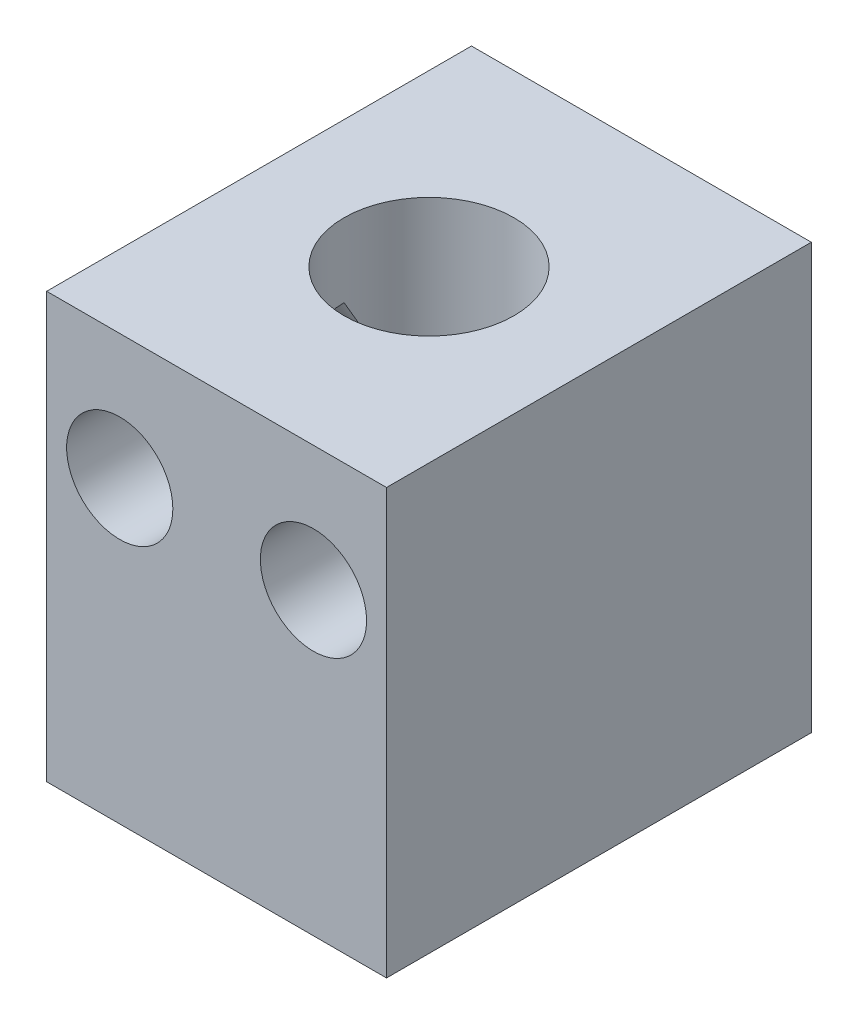
ISO-10303-21;
HEADER;
FILE_DESCRIPTION(('STEP AP214'),'2;1');
FILE_NAME('part.step','',(''),(''),'','','');
FILE_SCHEMA(('AUTOMOTIVE_DESIGN { 1 0 10303 214 1 1 1 1 }'));
ENDSEC;
DATA;
#1=APPLICATION_CONTEXT('core data for automotive mechanical design processes');
#2=APPLICATION_PROTOCOL_DEFINITION('international standard','automotive_design',2000,#1);
#3=PRODUCT_CONTEXT('',#1,'mechanical');
#4=PRODUCT('Part','Part','',(#3));
#5=PRODUCT_RELATED_PRODUCT_CATEGORY('part','',(#4));
#6=PRODUCT_DEFINITION_FORMATION('','',#4);
#7=PRODUCT_DEFINITION_CONTEXT('part definition',#1,'design');
#8=PRODUCT_DEFINITION('design','',#6,#7);
#9=PRODUCT_DEFINITION_SHAPE('','',#8);
#10=(LENGTH_UNIT() NAMED_UNIT(*) SI_UNIT(.MILLI.,.METRE.));
#11=(NAMED_UNIT(*) PLANE_ANGLE_UNIT() SI_UNIT($,.RADIAN.));
#12=(NAMED_UNIT(*) SI_UNIT($,.STERADIAN.) SOLID_ANGLE_UNIT());
#13=UNCERTAINTY_MEASURE_WITH_UNIT(LENGTH_MEASURE(1.E-05),#10,'distance_accuracy_value','');
#14=(GEOMETRIC_REPRESENTATION_CONTEXT(3) GLOBAL_UNCERTAINTY_ASSIGNED_CONTEXT((#13)) GLOBAL_UNIT_ASSIGNED_CONTEXT((#10,
#11,#12)) REPRESENTATION_CONTEXT('',''));
#15=CARTESIAN_POINT('',(0.,0.,0.));
#16=DIRECTION('',(0.,0.,1.));
#17=DIRECTION('',(1.,0.,0.));
#18=AXIS2_PLACEMENT_3D('',#15,#16,#17);
#19=CARTESIAN_POINT('',(0.,10.,0.));
#20=DIRECTION('',(0.,-1.,0.));
#21=DIRECTION('',(0.,0.,-1.));
#22=AXIS2_PLACEMENT_3D('',#19,#20,#21);
#23=PLANE('',#22);
#24=DIRECTION('',(0.,0.,-1.));
#25=VECTOR('',#24,1.);
#26=CARTESIAN_POINT('',(4.,10.,5.));
#27=LINE('',#26,#25);
#28=CARTESIAN_POINT('',(4.,10.,5.));
#29=VERTEX_POINT('',#28);
#30=CARTESIAN_POINT('',(4.,10.,-5.));
#31=VERTEX_POINT('',#30);
#32=EDGE_CURVE('E162',#29,#31,#27,.T.);
#33=ORIENTED_EDGE('',*,*,#32,.T.);
#34=DIRECTION('',(-1.,0.,0.));
#35=VECTOR('',#34,1.);
#36=CARTESIAN_POINT('',(-4.,10.,-5.));
#37=LINE('',#36,#35);
#38=CARTESIAN_POINT('',(-4.,10.,-5.));
#39=VERTEX_POINT('',#38);
#40=EDGE_CURVE('E217',#31,#39,#37,.T.);
#41=ORIENTED_EDGE('',*,*,#40,.T.);
#42=DIRECTION('',(0.,0.,1.));
#43=VECTOR('',#42,1.);
#44=CARTESIAN_POINT('',(-4.,10.,5.));
#45=LINE('',#44,#43);
#46=CARTESIAN_POINT('',(-4.,10.,5.));
#47=VERTEX_POINT('',#46);
#48=EDGE_CURVE('E155',#39,#47,#45,.T.);
#49=ORIENTED_EDGE('',*,*,#48,.T.);
#50=DIRECTION('',(1.,0.,0.));
#51=VECTOR('',#50,1.);
#52=CARTESIAN_POINT('',(-4.,10.,5.));
#53=LINE('',#52,#51);
#54=EDGE_CURVE('E169',#47,#29,#53,.T.);
#55=ORIENTED_EDGE('',*,*,#54,.T.);
#56=EDGE_LOOP('',(#33,#41,#49,#55));
#57=FACE_BOUND('',#56,.T.);
#58=CARTESIAN_POINT('',(0.,10.,0.));
#59=DIRECTION('',(0.,1.,0.));
#60=DIRECTION('',(0.,0.,1.));
#61=AXIS2_PLACEMENT_3D('',#58,#59,#60);
#62=CIRCLE('',#61,2.);
#63=CARTESIAN_POINT('',(0.,10.,2.));
#64=VERTEX_POINT('',#63);
#65=EDGE_CURVE('E211',#64,#64,#62,.T.);
#66=ORIENTED_EDGE('',*,*,#65,.F.);
#67=EDGE_LOOP('',(#66));
#68=FACE_BOUND('',#67,.T.);
#69=ADVANCED_FACE('F35',(#57,#68),#23,.F.);
#70=CARTESIAN_POINT('',(0.,0.,0.));
#71=DIRECTION('',(0.,-1.,0.));
#72=DIRECTION('',(0.,0.,-1.));
#73=AXIS2_PLACEMENT_3D('',#70,#71,#72);
#74=PLANE('',#73);
#75=DIRECTION('',(0.,0.,-1.));
#76=VECTOR('',#75,1.);
#77=CARTESIAN_POINT('',(4.,0.,5.));
#78=LINE('',#77,#76);
#79=CARTESIAN_POINT('',(4.,0.,5.));
#80=VERTEX_POINT('',#79);
#81=CARTESIAN_POINT('',(4.,0.,-5.));
#82=VERTEX_POINT('',#81);
#83=EDGE_CURVE('E151',#80,#82,#78,.T.);
#84=ORIENTED_EDGE('',*,*,#83,.F.);
#85=DIRECTION('',(1.,0.,0.));
#86=VECTOR('',#85,1.);
#87=CARTESIAN_POINT('',(-4.,0.,5.));
#88=LINE('',#87,#86);
#89=CARTESIAN_POINT('',(-4.,0.,5.));
#90=VERTEX_POINT('',#89);
#91=EDGE_CURVE('E160',#90,#80,#88,.T.);
#92=ORIENTED_EDGE('',*,*,#91,.F.);
#93=DIRECTION('',(0.,0.,1.));
#94=VECTOR('',#93,1.);
#95=CARTESIAN_POINT('',(-4.,0.,5.));
#96=LINE('',#95,#94);
#97=CARTESIAN_POINT('',(-4.,0.,-5.));
#98=VERTEX_POINT('',#97);
#99=EDGE_CURVE('E150',#98,#90,#96,.T.);
#100=ORIENTED_EDGE('',*,*,#99,.F.);
#101=DIRECTION('',(-1.,0.,0.));
#102=VECTOR('',#101,1.);
#103=CARTESIAN_POINT('',(-4.,0.,-5.));
#104=LINE('',#103,#102);
#105=EDGE_CURVE('E141',#82,#98,#104,.T.);
#106=ORIENTED_EDGE('',*,*,#105,.F.);
#107=EDGE_LOOP('',(#84,#92,#100,#106));
#108=FACE_BOUND('',#107,.T.);
#109=CARTESIAN_POINT('',(0.,0.,0.));
#110=DIRECTION('',(0.,1.,0.));
#111=DIRECTION('',(0.,0.,1.));
#112=AXIS2_PLACEMENT_3D('',#109,#110,#111);
#113=CIRCLE('',#112,2.);
#114=CARTESIAN_POINT('',(0.,0.,2.));
#115=VERTEX_POINT('',#114);
#116=EDGE_CURVE('E194',#115,#115,#113,.T.);
#117=ORIENTED_EDGE('',*,*,#116,.T.);
#118=EDGE_LOOP('',(#117));
#119=FACE_BOUND('',#118,.T.);
#120=ADVANCED_FACE('F111',(#108,#119),#74,.T.);
#121=CARTESIAN_POINT('',(4.,10.,5.));
#122=DIRECTION('',(-1.,0.,0.));
#123=DIRECTION('',(0.,0.,1.));
#124=AXIS2_PLACEMENT_3D('',#121,#122,#123);
#125=PLANE('',#124);
#126=ORIENTED_EDGE('',*,*,#83,.T.);
#127=DIRECTION('',(0.,-1.,0.));
#128=VECTOR('',#127,1.);
#129=CARTESIAN_POINT('',(4.,10.,-5.));
#130=LINE('',#129,#128);
#131=EDGE_CURVE('E146',#31,#82,#130,.T.);
#132=ORIENTED_EDGE('',*,*,#131,.F.);
#133=ORIENTED_EDGE('',*,*,#32,.F.);
#134=DIRECTION('',(0.,-1.,0.));
#135=VECTOR('',#134,1.);
#136=CARTESIAN_POINT('',(4.,10.,5.));
#137=LINE('',#136,#135);
#138=EDGE_CURVE('E166',#29,#80,#137,.T.);
#139=ORIENTED_EDGE('',*,*,#138,.T.);
#140=EDGE_LOOP('',(#126,#132,#133,#139));
#141=FACE_BOUND('',#140,.T.);
#142=ADVANCED_FACE('F37',(#141),#125,.F.);
#143=CARTESIAN_POINT('',(-4.,10.,-5.));
#144=DIRECTION('',(0.,0.,1.));
#145=DIRECTION('',(1.,0.,0.));
#146=AXIS2_PLACEMENT_3D('',#143,#144,#145);
#147=PLANE('',#146);
#148=ORIENTED_EDGE('',*,*,#105,.T.);
#149=DIRECTION('',(0.,-1.,0.));
#150=VECTOR('',#149,1.);
#151=CARTESIAN_POINT('',(-4.,10.,-5.));
#152=LINE('',#151,#150);
#153=EDGE_CURVE('E143',#39,#98,#152,.T.);
#154=ORIENTED_EDGE('',*,*,#153,.F.);
#155=ORIENTED_EDGE('',*,*,#40,.F.);
#156=ORIENTED_EDGE('',*,*,#131,.T.);
#157=EDGE_LOOP('',(#148,#154,#155,#156));
#158=FACE_BOUND('',#157,.T.);
#159=ADVANCED_FACE('F131',(#158),#147,.F.);
#160=CARTESIAN_POINT('',(-4.,10.,5.));
#161=DIRECTION('',(1.,0.,0.));
#162=DIRECTION('',(0.,0.,-1.));
#163=AXIS2_PLACEMENT_3D('',#160,#161,#162);
#164=PLANE('',#163);
#165=ORIENTED_EDGE('',*,*,#99,.T.);
#166=DIRECTION('',(0.,-1.,0.));
#167=VECTOR('',#166,1.);
#168=CARTESIAN_POINT('',(-4.,10.,5.));
#169=LINE('',#168,#167);
#170=EDGE_CURVE('E156',#47,#90,#169,.T.);
#171=ORIENTED_EDGE('',*,*,#170,.F.);
#172=ORIENTED_EDGE('',*,*,#48,.F.);
#173=ORIENTED_EDGE('',*,*,#153,.T.);
#174=EDGE_LOOP('',(#165,#171,#172,#173));
#175=FACE_BOUND('',#174,.T.);
#176=ADVANCED_FACE('F128',(#175),#164,.F.);
#177=CARTESIAN_POINT('',(-4.,10.,5.));
#178=DIRECTION('',(0.,0.,-1.));
#179=DIRECTION('',(-1.,0.,0.));
#180=AXIS2_PLACEMENT_3D('',#177,#178,#179);
#181=PLANE('',#180);
#182=CARTESIAN_POINT('',(-2.28020815313038,7.04972306374045,5.));
#183=DIRECTION('',(0.,0.,1.));
#184=DIRECTION('',(1.,0.,0.));
#185=AXIS2_PLACEMENT_3D('',#182,#183,#184);
#186=CIRCLE('',#185,1.25);
#187=CARTESIAN_POINT('',(-1.03020815313038,7.04972306374045,5.));
#188=VERTEX_POINT('',#187);
#189=EDGE_CURVE('E204',#188,#188,#186,.T.);
#190=ORIENTED_EDGE('',*,*,#189,.F.);
#191=EDGE_LOOP('',(#190));
#192=FACE_BOUND('',#191,.T.);
#193=CARTESIAN_POINT('',(2.28020815313038,7.04972306374045,5.));
#194=DIRECTION('',(0.,0.,1.));
#195=DIRECTION('',(1.,0.,0.));
#196=AXIS2_PLACEMENT_3D('',#193,#194,#195);
#197=CIRCLE('',#196,1.25);
#198=CARTESIAN_POINT('',(3.53020815313037,7.04972306374045,5.));
#199=VERTEX_POINT('',#198);
#200=EDGE_CURVE('E195',#199,#199,#197,.T.);
#201=ORIENTED_EDGE('',*,*,#200,.F.);
#202=EDGE_LOOP('',(#201));
#203=FACE_BOUND('',#202,.T.);
#204=ORIENTED_EDGE('',*,*,#91,.T.);
#205=ORIENTED_EDGE('',*,*,#138,.F.);
#206=ORIENTED_EDGE('',*,*,#54,.F.);
#207=ORIENTED_EDGE('',*,*,#170,.T.);
#208=EDGE_LOOP('',(#204,#205,#206,#207));
#209=FACE_BOUND('',#208,.T.);
#210=ADVANCED_FACE('F125',(#192,#203,#209),#181,.F.);
#211=CARTESIAN_POINT('',(0.,10.,0.));
#212=DIRECTION('',(0.,-1.,0.));
#213=DIRECTION('',(0.,0.,-1.));
#214=AXIS2_PLACEMENT_3D('',#211,#212,#213);
#215=CYLINDRICAL_SURFACE('',#214,2.);
#216=CARTESIAN_POINT('',(-2.,8.26791163326459,0.));
#217=CARTESIAN_POINT('',(-2.00000558938351,8.26788863704313,0.0528844995971377));
#218=CARTESIAN_POINT('',(-1.99790246234436,8.26742841862777,0.10576953300135));
#219=CARTESIAN_POINT('',(-1.98951806340914,8.26546708205457,0.211212400541034));
#220=CARTESIAN_POINT('',(-1.98323484130776,8.2639654780289,0.263770070388567));
#221=CARTESIAN_POINT('',(-1.96648521400252,8.25974343492132,0.368457391850015));
#222=CARTESIAN_POINT('',(-1.95599675119483,8.25701655971722,0.420583283478383));
#223=CARTESIAN_POINT('',(-1.93094290907026,8.25000702407965,0.523715438374782));
#224=CARTESIAN_POINT('',(-1.91637859145271,8.24572476871308,0.574721989487955));
#225=CARTESIAN_POINT('',(-1.87172549937202,8.23147126061031,0.710432491034155));
#226=CARTESIAN_POINT('',(-1.83790224680507,8.21961577322649,0.793761476188894));
#227=CARTESIAN_POINT('',(-1.76025449537854,8.18722208522691,0.953598898308244));
#228=CARTESIAN_POINT('',(-1.71646136909814,8.16671095240512,1.03012770514183));
#229=CARTESIAN_POINT('',(-1.63179549228915,8.11924216440194,1.15836832606298));
#230=CARTESIAN_POINT('',(-1.59233349331779,8.0946323375171,1.21187093702319));
#231=CARTESIAN_POINT('',(-1.51108858226605,8.03635700116809,1.31177155583983));
#232=CARTESIAN_POINT('',(-1.46930685697118,8.00269608902594,1.35817315179482));
#233=CARTESIAN_POINT('',(-1.38612245582258,7.92514261004233,1.44299155504776));
#234=CARTESIAN_POINT('',(-1.34472501605319,7.881174784248,1.48134549585502));
#235=CARTESIAN_POINT('',(-1.2662627653178,7.78343217721061,1.54895858054666));
#236=CARTESIAN_POINT('',(-1.22919623570255,7.72966130797865,1.57822133981454));
#237=CARTESIAN_POINT('',(-1.16699532490008,7.62126413771862,1.62463534058547));
#238=CARTESIAN_POINT('',(-1.14094322862788,7.56761477616068,1.64285309738624));
#239=CARTESIAN_POINT('',(-1.09640168907603,7.45559502500128,1.67291042327614));
#240=CARTESIAN_POINT('',(-1.07791137267302,7.39722518138454,1.68475072878982));
#241=CARTESIAN_POINT('',(-1.0501481516323,7.27984158964725,1.70218933066986));
#242=CARTESIAN_POINT('',(-1.04055223730491,7.22093623739241,1.70800734855564));
#243=CARTESIAN_POINT('',(-1.02988078645693,7.10207923705967,1.7144635564256));
#244=CARTESIAN_POINT('',(-1.02880512512072,7.04212760432193,1.71510182228943));
#245=CARTESIAN_POINT('',(-1.03525168493223,6.92245034964381,1.71121828579672));
#246=CARTESIAN_POINT('',(-1.04283176635153,6.86272895788109,1.70666175859808));
#247=CARTESIAN_POINT('',(-1.06629272932476,6.74562811488908,1.69210182025997));
#248=CARTESIAN_POINT('',(-1.08217293744265,6.68824847406748,1.68209885101828));
#249=CARTESIAN_POINT('',(-1.12131382164268,6.57760114998687,1.6562609440449));
#250=CARTESIAN_POINT('',(-1.14455836381777,6.52432479141307,1.64043874310693));
#251=CARTESIAN_POINT('',(-1.19703488463184,6.42324276677675,1.60254461507183));
#252=CARTESIAN_POINT('',(-1.22626545653387,6.37543581949107,1.58047415587104));
#253=CARTESIAN_POINT('',(-1.28873087813389,6.28656216553949,1.52995885283098));
#254=CARTESIAN_POINT('',(-1.32195130828317,6.24547238290565,1.50153666183249));
#255=CARTESIAN_POINT('',(-1.39035496412676,6.17037958214126,1.43842842028415));
#256=CARTESIAN_POINT('',(-1.42553843528555,6.13637745280081,1.40374158516607));
#257=CARTESIAN_POINT('',(-1.49761700336864,6.07378757221837,1.32667391839058));
#258=CARTESIAN_POINT('',(-1.53450621985885,6.04557215404621,1.2839873209072));
#259=CARTESIAN_POINT('',(-1.60615833861388,5.99613128082895,1.1931533996636));
#260=CARTESIAN_POINT('',(-1.64091971538291,5.97491079390047,1.14500222720458));
#261=CARTESIAN_POINT('',(-1.72142356504249,5.93024553204885,1.02187117625424));
#262=CARTESIAN_POINT('',(-1.76521085310458,5.9099781610709,0.944454142815698));
#263=CARTESIAN_POINT('',(-1.84256441251791,5.87808849081552,0.782959479635075));
#264=CARTESIAN_POINT('',(-1.87610862178009,5.86648477523175,0.698867957697389));
#265=CARTESIAN_POINT('',(-1.93208702690354,5.84881281498202,0.524916562924624));
#266=CARTESIAN_POINT('',(-1.95431716331684,5.84284468575338,0.43498164411715));
#267=CARTESIAN_POINT('',(-1.98609055651972,5.83470356668993,0.252904295402458));
#268=CARTESIAN_POINT('',(-1.99566050848839,5.83252258824724,0.160766928844989));
#269=CARTESIAN_POINT('',(-1.9996103239247,5.83162736187329,0.0456602762365201));
#270=CARTESIAN_POINT('',(-2.0000018109292,5.83153936215367,0.022826609295593));
#271=CARTESIAN_POINT('',(-2.,5.83153449421631,0.));
#272=B_SPLINE_CURVE_WITH_KNOTS('',3,(#216,#217,#218,#219,#220,#221,#222,#223,#224,#225,#226,
#227,#228,#229,#230,#231,#232,#233,#234,#235,#236,#237,#238,#239,#240,#241,#242,#243,#244,#245,
#246,#247,#248,#249,#250,#251,#252,#253,#254,#255,#256,#257,#258,#259,#260,#261,#262,#263,#264,
#265,#266,#267,#268,#269,#270,#271),.UNSPECIFIED.,.F.,.F.,(4,2,2,2,2,2,2,2,2,2,2,2,2,2,2,2,2,2,
2,2,2,2,2,2,2,2,2,4),(0.,0.158610142322732,0.317294335464578,0.476821992215116,
0.636308133009641,0.907307286610533,1.1774651837358,1.38929700451414,1.60102143204067,
1.81434282684096,2.02757927901783,2.21371958295567,2.3998383880706,2.57889782597944,
2.75795464079076,2.93821542274653,3.11846158139926,3.29831555304919,3.47812730681906,
3.65730773295387,3.83651061477341,4.02500888343165,4.21364074505989,4.48581676677934,
4.75857494668753,5.03609221087078,5.31302336635277,5.38151904885054),.UNSPECIFIED.);
#273=CARTESIAN_POINT('',(-2.,8.26791163326459,0.));
#274=VERTEX_POINT('',#273);
#275=CARTESIAN_POINT('',(-2.00000000000003,5.83153449421631,0.));
#276=VERTEX_POINT('',#275);
#277=EDGE_CURVE('E11',#274,#276,#272,.T.);
#278=ORIENTED_EDGE('',*,*,#277,.F.);
#279=CARTESIAN_POINT('',(-1.99858168929603,5.70353325566118,0.075307577378444));
#280=CARTESIAN_POINT('',(-1.9998174075336,5.7588716076493,0.0426298104194778));
#281=CARTESIAN_POINT('',(-2.00023850397146,5.81428011127291,0.0100402772033419));
#282=CARTESIAN_POINT('',(-1.99951128224771,5.92531432345885,-0.0547800300301167));
#283=CARTESIAN_POINT('',(-1.99836258431668,5.98094008133334,-0.087010715331924));
#284=CARTESIAN_POINT('',(-1.99454602245477,6.09272376767515,-0.151066766993519));
#285=CARTESIAN_POINT('',(-1.99187097042832,6.14888296889151,-0.18288948183892));
#286=CARTESIAN_POINT('',(-1.98511213835747,6.26162598129691,-0.245602471201465));
#287=CARTESIAN_POINT('',(-1.98102861675384,6.31820971272666,-0.276492915651305));
#288=CARTESIAN_POINT('',(-1.97365699762553,6.40830366061966,-0.324024994672272));
#289=CARTESIAN_POINT('',(-1.97075180508863,6.44155445009528,-0.341216909971724));
#290=CARTESIAN_POINT('',(-1.96464598241937,6.50844179555755,-0.374774890566007));
#291=CARTESIAN_POINT('',(-1.96144537759866,6.54207831827774,-0.391141026430159));
#292=CARTESIAN_POINT('',(-1.95489346536882,6.60998243656691,-0.422671031829075));
#293=CARTESIAN_POINT('',(-1.9515418912216,6.64425108045717,-0.437832631228168));
#294=CARTESIAN_POINT('',(-1.94495295863941,6.71357096267529,-0.466229250338109));
#295=CARTESIAN_POINT('',(-1.94171554149025,6.74862178310078,-0.479465271710004));
#296=CARTESIAN_POINT('',(-1.93519212489484,6.8268526004878,-0.505213666217769));
#297=CARTESIAN_POINT('',(-1.93202133661299,6.87027772546084,-0.517073962981593));
#298=CARTESIAN_POINT('',(-1.92864771232934,6.93631118691866,-0.529468633002989));
#299=CARTESIAN_POINT('',(-1.92775456923102,6.95836951641754,-0.532698262818102));
#300=CARTESIAN_POINT('',(-1.92653306517529,7.00270822943939,-0.537099305314656));
#301=CARTESIAN_POINT('',(-1.92620454705244,7.02498854943314,-0.5382712907509));
#302=CARTESIAN_POINT('',(-1.9261601396176,7.06969431559103,-0.538430302877442));
#303=CARTESIAN_POINT('',(-1.92644801597457,7.09211981458698,-0.537403899186378));
#304=CARTESIAN_POINT('',(-1.92760110708747,7.13676243084264,-0.533252612590067));
#305=CARTESIAN_POINT('',(-1.92846655091712,7.15897946187337,-0.530126897056656));
#306=CARTESIAN_POINT('',(-1.93067198495803,7.20327367941673,-0.522037422507077));
#307=CARTESIAN_POINT('',(-1.93201665260165,7.22534722209001,-0.51705552373857));
#308=CARTESIAN_POINT('',(-1.93503931283275,7.26908002933106,-0.505626323276663));
#309=CARTESIAN_POINT('',(-1.93671732050549,7.29073927510125,-0.499178955261786));
#310=CARTESIAN_POINT('',(-1.94174270967229,7.3513914113483,-0.479381809341753));
#311=CARTESIAN_POINT('',(-1.94532468108864,7.38993353680696,-0.464727650643387));
#312=CARTESIAN_POINT('',(-1.95259401343369,7.46608744465328,-0.433175381580307));
#313=CARTESIAN_POINT('',(-1.95628148276954,7.50369819012689,-0.41627489282003));
#314=CARTESIAN_POINT('',(-1.9634491476844,7.57837453178951,-0.381040470509639));
#315=CARTESIAN_POINT('',(-1.96692879625316,7.61543851124825,-0.362703024462447));
#316=CARTESIAN_POINT('',(-1.97348947791407,7.68914205443201,-0.325122412541073));
#317=CARTESIAN_POINT('',(-1.97657045519111,7.72578155807687,-0.305879120359099));
#318=CARTESIAN_POINT('',(-1.98505762425563,7.83540439725249,-0.247193526082561));
#319=CARTESIAN_POINT('',(-1.98969526198344,7.90796884581619,-0.20685652552453));
#320=CARTESIAN_POINT('',(-1.99650760036728,8.05245561985608,-0.125087324147775));
#321=CARTESIAN_POINT('',(-1.99868572939212,8.12437870016822,-0.0836567304172804));
#322=CARTESIAN_POINT('',(-1.9999684250856,8.22953457783826,-0.0224663316044411));
#323=CARTESIAN_POINT('',(-2.00009346926349,8.26290326402858,-0.00295764202008954));
#324=CARTESIAN_POINT('',(-1.99976903247966,8.32949528160712,0.0361234177560555));
#325=CARTESIAN_POINT('',(-1.99932089906523,8.36271877033811,0.0556955310748019));
#326=CARTESIAN_POINT('',(-1.99858168929699,8.39591287181979,0.0753075773783137));
#327=B_SPLINE_CURVE_WITH_KNOTS('',3,(#279,#280,#281,#282,#283,#284,#285,#286,#287,#288,#289,
#290,#291,#292,#293,#294,#295,#296,#297,#298,#299,#300,#301,#302,#303,#304,#305,#306,#307,#308,
#309,#310,#311,#312,#313,#314,#315,#316,#317,#318,#319,#320,#321,#322,#323,#324,#325,#326),
.UNSPECIFIED.,.F.,.F.,(4,2,2,2,2,2,2,2,2,2,2,2,2,2,2,2,2,2,2,2,2,2,2,4),(0.,0.192829622694144,
0.38570590357504,0.579498087777628,0.773254731858419,0.885880437784379,0.998496502603558,
1.11132000901336,1.22408461460053,1.3589847499571,1.42583068159976,1.4926580034173,
1.5598947501844,1.62715818012162,1.69509696796866,1.76303883107517,1.88706666633027,
2.01122688316049,2.13570067823406,2.26019188117758,2.50958822258228,2.75863649356897,
2.87459230245217,2.99027599829082),.UNSPECIFIED.);
#328=EDGE_CURVE('E48',#276,#274,#327,.T.);
#329=ORIENTED_EDGE('',*,*,#328,.F.);
#330=EDGE_LOOP('',(#278,#329));
#331=FACE_BOUND('',#330,.T.);
#332=CARTESIAN_POINT('',(2.,5.83153449421632,0.));
#333=CARTESIAN_POINT('',(2.00000558938351,5.83155749043777,0.0528844995971374));
#334=CARTESIAN_POINT('',(1.99790246234436,5.83201770885314,0.10576953300135));
#335=CARTESIAN_POINT('',(1.98951806340914,5.83397904542633,0.211212400541034));
#336=CARTESIAN_POINT('',(1.98323484130776,5.835480649452,0.263770070388567));
#337=CARTESIAN_POINT('',(1.96648521400252,5.83970269255959,0.368457391850015));
#338=CARTESIAN_POINT('',(1.95599675119483,5.84242956776369,0.420583283478383));
#339=CARTESIAN_POINT('',(1.93094290907026,5.84943910340125,0.523715438374782));
#340=CARTESIAN_POINT('',(1.91637859145271,5.85372135876783,0.574721989487955));
#341=CARTESIAN_POINT('',(1.87172549937202,5.86797486687059,0.710432491034155));
#342=CARTESIAN_POINT('',(1.83790224680507,5.87983035425441,0.793761476188894));
#343=CARTESIAN_POINT('',(1.76025449537854,5.912224042254,0.953598898308244));
#344=CARTESIAN_POINT('',(1.71646136909814,5.93273517507578,1.03012770514183));
#345=CARTESIAN_POINT('',(1.63179549228915,5.98020396307896,1.15836832606298));
#346=CARTESIAN_POINT('',(1.59233349331779,6.0048137899638,1.21187093702319));
#347=CARTESIAN_POINT('',(1.51108858226605,6.06308912631282,1.31177155583983));
#348=CARTESIAN_POINT('',(1.46930685697118,6.09675003845496,1.35817315179482));
#349=CARTESIAN_POINT('',(1.38612245582258,6.17430351743857,1.44299155504776));
#350=CARTESIAN_POINT('',(1.34472501605319,6.21827134323291,1.48134549585502));
#351=CARTESIAN_POINT('',(1.2662627653178,6.31601395027029,1.54895858054666));
#352=CARTESIAN_POINT('',(1.22919623570255,6.36978481950225,1.57822133981454));
#353=CARTESIAN_POINT('',(1.16699532490008,6.47818198976229,1.62463534058547));
#354=CARTESIAN_POINT('',(1.14094322862788,6.53183135132023,1.64285309738624));
#355=CARTESIAN_POINT('',(1.09640168907603,6.64385110247962,1.67291042327614));
#356=CARTESIAN_POINT('',(1.07791137267302,6.70222094609636,1.68475072878982));
#357=CARTESIAN_POINT('',(1.0501481516323,6.81960453783365,1.70218933066986));
#358=CARTESIAN_POINT('',(1.04055223730491,6.8785098900885,1.70800734855564));
#359=CARTESIAN_POINT('',(1.02988078645693,6.99736689042123,1.7144635564256));
#360=CARTESIAN_POINT('',(1.02880512512072,7.05731852315897,1.71510182228943));
#361=CARTESIAN_POINT('',(1.03525168493223,7.17699577783709,1.71121828579672));
#362=CARTESIAN_POINT('',(1.04283176635153,7.23671716959981,1.70666175859808));
#363=CARTESIAN_POINT('',(1.06629272932476,7.35381801259182,1.69210182025997));
#364=CARTESIAN_POINT('',(1.08217293744264,7.41119765341342,1.68209885101828));
#365=CARTESIAN_POINT('',(1.12131382164268,7.52184497749403,1.6562609440449));
#366=CARTESIAN_POINT('',(1.14455836381777,7.57512133606783,1.64043874310693));
#367=CARTESIAN_POINT('',(1.19703488463183,7.67620336070415,1.60254461507183));
#368=CARTESIAN_POINT('',(1.22626545653387,7.72401030798983,1.58047415587104));
#369=CARTESIAN_POINT('',(1.28873087813389,7.81288396194141,1.52995885283098));
#370=CARTESIAN_POINT('',(1.32195130828317,7.85397374457525,1.50153666183249));
#371=CARTESIAN_POINT('',(1.39035496412676,7.92906654533964,1.43842842028416));
#372=CARTESIAN_POINT('',(1.42553843528555,7.96306867468009,1.40374158516608));
#373=CARTESIAN_POINT('',(1.49761700336864,8.02565855526253,1.32667391839058));
#374=CARTESIAN_POINT('',(1.53450621985884,8.05387397343469,1.28398732090721));
#375=CARTESIAN_POINT('',(1.60615833861388,8.10331484665195,1.19315339966361));
#376=CARTESIAN_POINT('',(1.64091971538291,8.12453533358043,1.14500222720459));
#377=CARTESIAN_POINT('',(1.72142356504248,8.16920059543206,1.02187117625424));
#378=CARTESIAN_POINT('',(1.76521085310458,8.18946796641001,0.944454142815701));
#379=CARTESIAN_POINT('',(1.84256441251791,8.22135763666539,0.782959479635078));
#380=CARTESIAN_POINT('',(1.87610862178008,8.23296135224915,0.698867957697392));
#381=CARTESIAN_POINT('',(1.93208702690354,8.25063331249888,0.524916562924627));
#382=CARTESIAN_POINT('',(1.95431716331684,8.25660144172752,0.434981644117153));
#383=CARTESIAN_POINT('',(1.98609055651972,8.26474256079098,0.252904295402462));
#384=CARTESIAN_POINT('',(1.99566050848839,8.26692353923367,0.160766928844993));
#385=CARTESIAN_POINT('',(1.9996103239247,8.26781876560761,0.0456602762365227));
#386=CARTESIAN_POINT('',(2.0000018109292,8.26790676532724,0.0228266092955943));
#387=CARTESIAN_POINT('',(2.,8.26791163326459,0.));
#388=B_SPLINE_CURVE_WITH_KNOTS('',3,(#332,#333,#334,#335,#336,#337,#338,#339,#340,#341,#342,
#343,#344,#345,#346,#347,#348,#349,#350,#351,#352,#353,#354,#355,#356,#357,#358,#359,#360,#361,
#362,#363,#364,#365,#366,#367,#368,#369,#370,#371,#372,#373,#374,#375,#376,#377,#378,#379,#380,
#381,#382,#383,#384,#385,#386,#387),.UNSPECIFIED.,.F.,.F.,(4,2,2,2,2,2,2,2,2,2,2,2,2,2,2,2,2,2,
2,2,2,2,2,2,2,2,2,4),(0.,0.158610142322732,0.317294335464579,0.476821992215116,
0.636308133009641,0.907307286610533,1.1774651837358,1.38929700451414,1.60102143204066,
1.81434282684095,2.02757927901783,2.21371958295567,2.39983838807059,2.57889782597944,
2.75795464079076,2.93821542274653,3.11846158139925,3.29831555304919,3.47812730681906,
3.65730773295386,3.83651061477341,4.02500888343164,4.21364074505989,4.48581676677934,
4.75857494668753,5.03609221087078,5.31302336635277,5.38151904885054),.UNSPECIFIED.);
#389=CARTESIAN_POINT('',(2.,5.83153449421632,0.));
#390=VERTEX_POINT('',#389);
#391=CARTESIAN_POINT('',(2.00000000000003,8.26791163326459,0.));
#392=VERTEX_POINT('',#391);
#393=EDGE_CURVE('E177',#390,#392,#388,.T.);
#394=ORIENTED_EDGE('',*,*,#393,.F.);
#395=CARTESIAN_POINT('',(1.99858168929603,8.39591287181972,0.075307577378444));
#396=CARTESIAN_POINT('',(1.9998174075336,8.34057451983161,0.0426298104194784));
#397=CARTESIAN_POINT('',(2.00023850397146,8.285166016208,0.0100402772033427));
#398=CARTESIAN_POINT('',(1.99951128224771,8.17413180402206,-0.054780030030116));
#399=CARTESIAN_POINT('',(1.99836258431668,8.11850604614756,-0.0870107153319235));
#400=CARTESIAN_POINT('',(1.99454602245477,8.00672235980576,-0.151066766993518));
#401=CARTESIAN_POINT('',(1.99187097042832,7.95056315858939,-0.18288948183892));
#402=CARTESIAN_POINT('',(1.98511213835747,7.837820146184,-0.245602471201464));
#403=CARTESIAN_POINT('',(1.98102861675384,7.78123641475424,-0.276492915651304));
#404=CARTESIAN_POINT('',(1.97365699762553,7.69114246686125,-0.324024994672272));
#405=CARTESIAN_POINT('',(1.97075180508863,7.65789167738563,-0.341216909971724));
#406=CARTESIAN_POINT('',(1.96464598241937,7.59100433192336,-0.374774890566007));
#407=CARTESIAN_POINT('',(1.96144537759866,7.55736780920316,-0.391141026430159));
#408=CARTESIAN_POINT('',(1.95489346536882,7.48946369091399,-0.422671031829075));
#409=CARTESIAN_POINT('',(1.9515418912216,7.45519504702374,-0.437832631228168));
#410=CARTESIAN_POINT('',(1.94495295863941,7.38587516480561,-0.46622925033811));
#411=CARTESIAN_POINT('',(1.94171554149025,7.35082434438013,-0.479465271710004));
#412=CARTESIAN_POINT('',(1.93519212489484,7.27259352699311,-0.505213666217769));
#413=CARTESIAN_POINT('',(1.93202133661299,7.22916840202006,-0.517073962981593));
#414=CARTESIAN_POINT('',(1.92864771232934,7.16313494056225,-0.529468633002989));
#415=CARTESIAN_POINT('',(1.92775456923102,7.14107661106337,-0.532698262818102));
#416=CARTESIAN_POINT('',(1.92653306517529,7.09673789804151,-0.537099305314656));
#417=CARTESIAN_POINT('',(1.92620454705244,7.07445757804776,-0.5382712907509));
#418=CARTESIAN_POINT('',(1.9261601396176,7.02975181188987,-0.538430302877443));
#419=CARTESIAN_POINT('',(1.92644801597457,7.00732631289392,-0.537403899186378));
#420=CARTESIAN_POINT('',(1.92760110708747,6.96268369663826,-0.533252612590067));
#421=CARTESIAN_POINT('',(1.92846655091712,6.94046666560753,-0.530126897056657));
#422=CARTESIAN_POINT('',(1.93067198495803,6.89617244806417,-0.522037422507078));
#423=CARTESIAN_POINT('',(1.93201665260165,6.8740989053909,-0.517055523738571));
#424=CARTESIAN_POINT('',(1.93503931283275,6.83036609814985,-0.505626323276663));
#425=CARTESIAN_POINT('',(1.93671732050549,6.80870685237965,-0.499178955261786));
#426=CARTESIAN_POINT('',(1.94174270967229,6.7480547161326,-0.479381809341753));
#427=CARTESIAN_POINT('',(1.94532468108864,6.70951259067394,-0.464727650643387));
#428=CARTESIAN_POINT('',(1.95259401343369,6.63335868282762,-0.433175381580307));
#429=CARTESIAN_POINT('',(1.95628148276955,6.59574793735401,-0.416274892820029));
#430=CARTESIAN_POINT('',(1.9634491476844,6.52107159569139,-0.381040470509639));
#431=CARTESIAN_POINT('',(1.96692879625316,6.48400761623265,-0.362703024462447));
#432=CARTESIAN_POINT('',(1.97348947791407,6.41030407304889,-0.325122412541072));
#433=CARTESIAN_POINT('',(1.97657045519111,6.37366456940403,-0.305879120359098));
#434=CARTESIAN_POINT('',(1.98505762425563,6.26404173022841,-0.24719352608256));
#435=CARTESIAN_POINT('',(1.98969526198344,6.19147728166471,-0.206856525524529));
#436=CARTESIAN_POINT('',(1.99650760036728,6.04699050762482,-0.125087324147773));
#437=CARTESIAN_POINT('',(1.99868572939212,5.97506742731268,-0.0836567304172782));
#438=CARTESIAN_POINT('',(1.9999684250856,5.86991154964265,-0.0224663316044391));
#439=CARTESIAN_POINT('',(2.00009346926349,5.83654286345232,-0.00295764202008798));
#440=CARTESIAN_POINT('',(1.99976903247966,5.76995084587378,0.0361234177560561));
#441=CARTESIAN_POINT('',(1.99932089906523,5.73672735714279,0.055695531074802));
#442=CARTESIAN_POINT('',(1.99858168929699,5.70353325566112,0.0753075773783134));
#443=B_SPLINE_CURVE_WITH_KNOTS('',3,(#395,#396,#397,#398,#399,#400,#401,#402,#403,#404,#405,
#406,#407,#408,#409,#410,#411,#412,#413,#414,#415,#416,#417,#418,#419,#420,#421,#422,#423,#424,
#425,#426,#427,#428,#429,#430,#431,#432,#433,#434,#435,#436,#437,#438,#439,#440,#441,#442),
.UNSPECIFIED.,.F.,.F.,(4,2,2,2,2,2,2,2,2,2,2,2,2,2,2,2,2,2,2,2,2,2,2,4),(0.,0.192829622694144,
0.385705903575039,0.579498087777627,0.773254731858418,0.885880437784378,0.998496502603557,
1.11132000901336,1.22408461460053,1.3589847499571,1.42583068159977,1.4926580034173,
1.5598947501844,1.62715818012162,1.69509696796866,1.76303883107517,1.88706666633027,
2.0112268831605,2.13570067823406,2.26019188117758,2.50958822258228,2.75863649356898,
2.87459230245218,2.99027599829082),.UNSPECIFIED.);
#444=EDGE_CURVE('E172',#392,#390,#443,.T.);
#445=ORIENTED_EDGE('',*,*,#444,.F.);
#446=EDGE_LOOP('',(#394,#445));
#447=FACE_BOUND('',#446,.T.);
#448=ORIENTED_EDGE('',*,*,#65,.T.);
#449=EDGE_LOOP('',(#448));
#450=FACE_BOUND('',#449,.T.);
#451=ORIENTED_EDGE('',*,*,#116,.F.);
#452=EDGE_LOOP('',(#451));
#453=FACE_BOUND('',#452,.T.);
#454=ADVANCED_FACE('F121',(#331,#447,#450,#453),#215,.F.);
#455=CARTESIAN_POINT('',(2.28020815313038,7.04972306374045,0.));
#456=DIRECTION('',(0.,0.,1.));
#457=DIRECTION('',(1.,0.,0.));
#458=AXIS2_PLACEMENT_3D('',#455,#456,#457);
#459=CONICAL_SURFACE('',#458,1.25,1.02974425867665);
#460=ORIENTED_EDGE('',*,*,#444,.T.);
#461=CARTESIAN_POINT('',(2.28020815313038,7.04972306374045,0.));
#462=DIRECTION('',(0.,0.,1.));
#463=DIRECTION('',(1.,0.,0.));
#464=AXIS2_PLACEMENT_3D('',#461,#462,#463);
#465=CIRCLE('',#464,1.25);
#466=EDGE_CURVE('E60',#390,#392,#465,.T.);
#467=ORIENTED_EDGE('',*,*,#466,.T.);
#468=EDGE_LOOP('',(#460,#467));
#469=FACE_BOUND('',#468,.T.);
#470=CARTESIAN_POINT('',(2.28020815313037,7.04972306374045,-0.75107577378445));
#471=VERTEX_POINT('',#470);
#472=VERTEX_LOOP('',#471);
#473=FACE_BOUND('',#472,.T.);
#474=ADVANCED_FACE('F106',(#469,#473),#459,.F.);
#475=CARTESIAN_POINT('',(2.28020815313038,7.04972306374045,5.));
#476=DIRECTION('',(0.,0.,1.));
#477=DIRECTION('',(1.,0.,0.));
#478=AXIS2_PLACEMENT_3D('',#475,#476,#477);
#479=CYLINDRICAL_SURFACE('',#478,1.25);
#480=ORIENTED_EDGE('',*,*,#393,.T.);
#481=ORIENTED_EDGE('',*,*,#466,.F.);
#482=EDGE_LOOP('',(#480,#481));
#483=FACE_BOUND('',#482,.T.);
#484=ORIENTED_EDGE('',*,*,#200,.T.);
#485=EDGE_LOOP('',(#484));
#486=FACE_BOUND('',#485,.T.);
#487=ADVANCED_FACE('F99',(#483,#486),#479,.F.);
#488=CARTESIAN_POINT('',(-2.28020815313038,7.04972306374045,0.));
#489=DIRECTION('',(0.,0.,1.));
#490=DIRECTION('',(1.,0.,0.));
#491=AXIS2_PLACEMENT_3D('',#488,#489,#490);
#492=CONICAL_SURFACE('',#491,1.25,1.02974425867665);
#493=ORIENTED_EDGE('',*,*,#328,.T.);
#494=CARTESIAN_POINT('',(-2.28020815313038,7.04972306374045,0.));
#495=DIRECTION('',(0.,0.,1.));
#496=DIRECTION('',(1.,0.,0.));
#497=AXIS2_PLACEMENT_3D('',#494,#495,#496);
#498=CIRCLE('',#497,1.25);
#499=EDGE_CURVE('E54',#274,#276,#498,.T.);
#500=ORIENTED_EDGE('',*,*,#499,.T.);
#501=EDGE_LOOP('',(#493,#500));
#502=FACE_BOUND('',#501,.T.);
#503=CARTESIAN_POINT('',(-2.28020815313038,7.04972306374045,-0.75107577378445));
#504=VERTEX_POINT('',#503);
#505=VERTEX_LOOP('',#504);
#506=FACE_BOUND('',#505,.T.);
#507=ADVANCED_FACE('F96',(#502,#506),#492,.F.);
#508=CARTESIAN_POINT('',(-2.28020815313038,7.04972306374045,5.));
#509=DIRECTION('',(0.,0.,1.));
#510=DIRECTION('',(1.,0.,0.));
#511=AXIS2_PLACEMENT_3D('',#508,#509,#510);
#512=CYLINDRICAL_SURFACE('',#511,1.25);
#513=ORIENTED_EDGE('',*,*,#277,.T.);
#514=ORIENTED_EDGE('',*,*,#499,.F.);
#515=EDGE_LOOP('',(#513,#514));
#516=FACE_BOUND('',#515,.T.);
#517=ORIENTED_EDGE('',*,*,#189,.T.);
#518=EDGE_LOOP('',(#517));
#519=FACE_BOUND('',#518,.T.);
#520=ADVANCED_FACE('F98',(#516,#519),#512,.F.);
#521=CLOSED_SHELL('',(#69,#120,#142,#159,#176,#210,#454,#474,#487,#507,#520));
#522=MANIFOLD_SOLID_BREP('B2',#521);
#523=ADVANCED_BREP_SHAPE_REPRESENTATION('',(#18,#522),#14);
#524=SHAPE_DEFINITION_REPRESENTATION(#9,#523);
ENDSEC;
END-ISO-10303-21;
